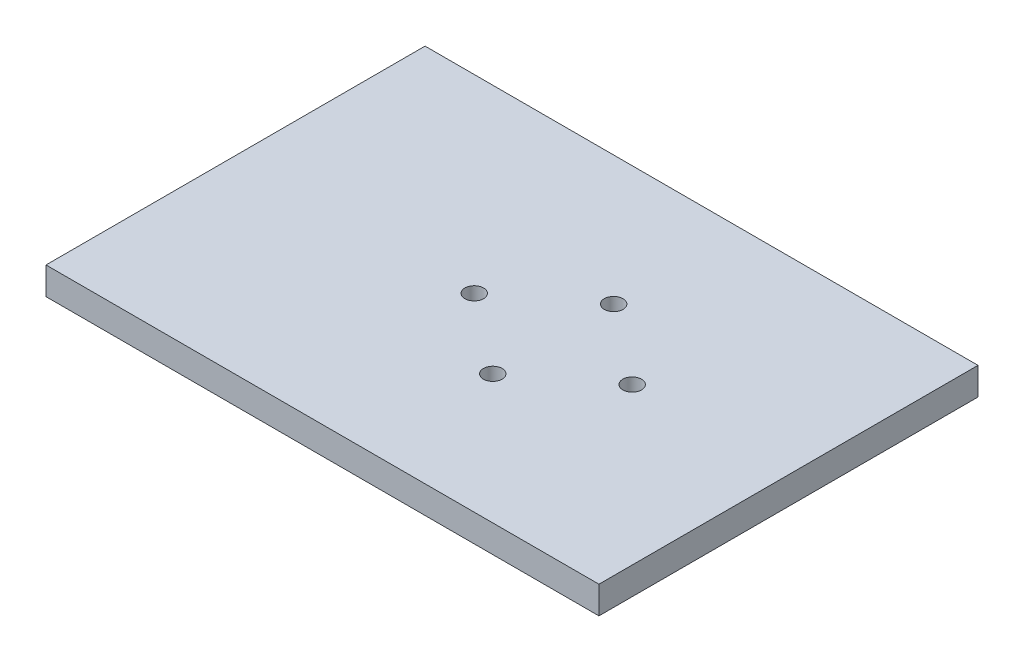
ISO-10303-21;
HEADER;
FILE_DESCRIPTION(('STEP AP214'),'2;1');
FILE_NAME('part.step','',(''),(''),'','','');
FILE_SCHEMA(('AUTOMOTIVE_DESIGN { 1 0 10303 214 1 1 1 1 }'));
ENDSEC;
DATA;
#1=APPLICATION_CONTEXT('core data for automotive mechanical design processes');
#2=APPLICATION_PROTOCOL_DEFINITION('international standard','automotive_design',2000,#1);
#3=PRODUCT_CONTEXT('',#1,'mechanical');
#4=PRODUCT('Part','Part','',(#3));
#5=PRODUCT_RELATED_PRODUCT_CATEGORY('part','',(#4));
#6=PRODUCT_DEFINITION_FORMATION('','',#4);
#7=PRODUCT_DEFINITION_CONTEXT('part definition',#1,'design');
#8=PRODUCT_DEFINITION('design','',#6,#7);
#9=PRODUCT_DEFINITION_SHAPE('','',#8);
#10=(LENGTH_UNIT() NAMED_UNIT(*) SI_UNIT(.MILLI.,.METRE.));
#11=(NAMED_UNIT(*) PLANE_ANGLE_UNIT() SI_UNIT($,.RADIAN.));
#12=(NAMED_UNIT(*) SI_UNIT($,.STERADIAN.) SOLID_ANGLE_UNIT());
#13=UNCERTAINTY_MEASURE_WITH_UNIT(LENGTH_MEASURE(1.E-05),#10,'distance_accuracy_value','');
#14=(GEOMETRIC_REPRESENTATION_CONTEXT(3) GLOBAL_UNCERTAINTY_ASSIGNED_CONTEXT((#13)) GLOBAL_UNIT_ASSIGNED_CONTEXT((#10,
#11,#12)) REPRESENTATION_CONTEXT('',''));
#15=CARTESIAN_POINT('',(0.,0.,0.));
#16=DIRECTION('',(0.,0.,1.));
#17=DIRECTION('',(1.,0.,0.));
#18=AXIS2_PLACEMENT_3D('',#15,#16,#17);
#19=CARTESIAN_POINT('',(0.,5.,0.));
#20=DIRECTION('',(0.,1.,0.));
#21=DIRECTION('',(0.,0.,1.));
#22=AXIS2_PLACEMENT_3D('',#19,#20,#21);
#23=PLANE('',#22);
#24=CARTESIAN_POINT('',(14.375,5.,0.));
#25=DIRECTION('',(0.,1.,0.));
#26=DIRECTION('',(0.,0.,-1.));
#27=AXIS2_PLACEMENT_3D('',#24,#25,#26);
#28=CIRCLE('',#27,1.7);
#29=CARTESIAN_POINT('',(14.375,5.,-1.7));
#30=VERTEX_POINT('',#29);
#31=EDGE_CURVE('E127',#30,#30,#28,.T.);
#32=ORIENTED_EDGE('',*,*,#31,.F.);
#33=EDGE_LOOP('',(#32));
#34=FACE_BOUND('',#33,.T.);
#35=CARTESIAN_POINT('',(0.,5.,11.));
#36=DIRECTION('',(0.,1.,0.));
#37=DIRECTION('',(0.,0.,-1.));
#38=AXIS2_PLACEMENT_3D('',#35,#36,#37);
#39=CIRCLE('',#38,1.7);
#40=CARTESIAN_POINT('',(0.,5.,9.3));
#41=VERTEX_POINT('',#40);
#42=EDGE_CURVE('E106',#41,#41,#39,.T.);
#43=ORIENTED_EDGE('',*,*,#42,.F.);
#44=EDGE_LOOP('',(#43));
#45=FACE_BOUND('',#44,.T.);
#46=DIRECTION('',(0.,0.,1.));
#47=VECTOR('',#46,1.);
#48=CARTESIAN_POINT('',(-57.825,5.,34.5));
#49=LINE('',#48,#47);
#50=CARTESIAN_POINT('',(-57.825,5.,-34.5));
#51=VERTEX_POINT('',#50);
#52=CARTESIAN_POINT('',(-57.825,5.,34.5));
#53=VERTEX_POINT('',#52);
#54=EDGE_CURVE('E91',#51,#53,#49,.T.);
#55=ORIENTED_EDGE('',*,*,#54,.T.);
#56=DIRECTION('',(1.,0.,0.));
#57=VECTOR('',#56,1.);
#58=CARTESIAN_POINT('',(42.825,5.,34.5));
#59=LINE('',#58,#57);
#60=CARTESIAN_POINT('',(42.825,5.,34.5));
#61=VERTEX_POINT('',#60);
#62=EDGE_CURVE('E86',#53,#61,#59,.T.);
#63=ORIENTED_EDGE('',*,*,#62,.T.);
#64=DIRECTION('',(0.,0.,-1.));
#65=VECTOR('',#64,1.);
#66=CARTESIAN_POINT('',(42.825,5.,34.5));
#67=LINE('',#66,#65);
#68=CARTESIAN_POINT('',(42.825,5.,-34.5));
#69=VERTEX_POINT('',#68);
#70=EDGE_CURVE('E89',#61,#69,#67,.T.);
#71=ORIENTED_EDGE('',*,*,#70,.T.);
#72=DIRECTION('',(-1.,0.,0.));
#73=VECTOR('',#72,1.);
#74=CARTESIAN_POINT('',(42.825,5.,-34.5));
#75=LINE('',#74,#73);
#76=EDGE_CURVE('E56',#69,#51,#75,.T.);
#77=ORIENTED_EDGE('',*,*,#76,.T.);
#78=EDGE_LOOP('',(#55,#63,#71,#77));
#79=FACE_BOUND('',#78,.T.);
#80=CARTESIAN_POINT('',(0.,5.,-11.));
#81=DIRECTION('',(0.,1.,0.));
#82=DIRECTION('',(0.,0.,1.));
#83=AXIS2_PLACEMENT_3D('',#80,#81,#82);
#84=CIRCLE('',#83,1.7);
#85=CARTESIAN_POINT('',(0.,5.,-9.3));
#86=VERTEX_POINT('',#85);
#87=EDGE_CURVE('E121',#86,#86,#84,.T.);
#88=ORIENTED_EDGE('',*,*,#87,.F.);
#89=EDGE_LOOP('',(#88));
#90=FACE_BOUND('',#89,.T.);
#91=CARTESIAN_POINT('',(-14.375,5.,0.));
#92=DIRECTION('',(0.,1.,0.));
#93=DIRECTION('',(0.,0.,1.));
#94=AXIS2_PLACEMENT_3D('',#91,#92,#93);
#95=CIRCLE('',#94,1.7);
#96=CARTESIAN_POINT('',(-14.375,5.,1.7));
#97=VERTEX_POINT('',#96);
#98=EDGE_CURVE('E133',#97,#97,#95,.T.);
#99=ORIENTED_EDGE('',*,*,#98,.F.);
#100=EDGE_LOOP('',(#99));
#101=FACE_BOUND('',#100,.T.);
#102=ADVANCED_FACE('F39',(#34,#45,#79,#90,#101),#23,.T.);
#103=CARTESIAN_POINT('',(0.,0.,0.));
#104=DIRECTION('',(0.,1.,0.));
#105=DIRECTION('',(0.,0.,1.));
#106=AXIS2_PLACEMENT_3D('',#103,#104,#105);
#107=PLANE('',#106);
#108=DIRECTION('',(0.,0.,1.));
#109=VECTOR('',#108,1.);
#110=CARTESIAN_POINT('',(-57.825,0.,34.5));
#111=LINE('',#110,#109);
#112=CARTESIAN_POINT('',(-57.825,0.,-34.5));
#113=VERTEX_POINT('',#112);
#114=CARTESIAN_POINT('',(-57.825,0.,34.5));
#115=VERTEX_POINT('',#114);
#116=EDGE_CURVE('E103',#113,#115,#111,.T.);
#117=ORIENTED_EDGE('',*,*,#116,.F.);
#118=DIRECTION('',(-1.,0.,0.));
#119=VECTOR('',#118,1.);
#120=CARTESIAN_POINT('',(42.825,0.,-34.5));
#121=LINE('',#120,#119);
#122=CARTESIAN_POINT('',(42.825,0.,-34.5));
#123=VERTEX_POINT('',#122);
#124=EDGE_CURVE('E79',#123,#113,#121,.T.);
#125=ORIENTED_EDGE('',*,*,#124,.F.);
#126=DIRECTION('',(0.,0.,-1.));
#127=VECTOR('',#126,1.);
#128=CARTESIAN_POINT('',(42.825,0.,34.5));
#129=LINE('',#128,#127);
#130=CARTESIAN_POINT('',(42.825,0.,34.5));
#131=VERTEX_POINT('',#130);
#132=EDGE_CURVE('E73',#131,#123,#129,.T.);
#133=ORIENTED_EDGE('',*,*,#132,.F.);
#134=DIRECTION('',(1.,0.,0.));
#135=VECTOR('',#134,1.);
#136=CARTESIAN_POINT('',(42.825,0.,34.5));
#137=LINE('',#136,#135);
#138=EDGE_CURVE('E95',#115,#131,#137,.T.);
#139=ORIENTED_EDGE('',*,*,#138,.F.);
#140=EDGE_LOOP('',(#117,#125,#133,#139));
#141=FACE_BOUND('',#140,.T.);
#142=CARTESIAN_POINT('',(0.,0.,11.));
#143=DIRECTION('',(0.,1.,0.));
#144=DIRECTION('',(0.,0.,-1.));
#145=AXIS2_PLACEMENT_3D('',#142,#143,#144);
#146=CIRCLE('',#145,1.7);
#147=CARTESIAN_POINT('',(0.,0.,9.3));
#148=VERTEX_POINT('',#147);
#149=EDGE_CURVE('E118',#148,#148,#146,.T.);
#150=ORIENTED_EDGE('',*,*,#149,.T.);
#151=EDGE_LOOP('',(#150));
#152=FACE_BOUND('',#151,.T.);
#153=CARTESIAN_POINT('',(0.,0.,-11.));
#154=DIRECTION('',(0.,1.,0.));
#155=DIRECTION('',(0.,0.,1.));
#156=AXIS2_PLACEMENT_3D('',#153,#154,#155);
#157=CIRCLE('',#156,1.7);
#158=CARTESIAN_POINT('',(0.,0.,-9.3));
#159=VERTEX_POINT('',#158);
#160=EDGE_CURVE('E124',#159,#159,#157,.T.);
#161=ORIENTED_EDGE('',*,*,#160,.T.);
#162=EDGE_LOOP('',(#161));
#163=FACE_BOUND('',#162,.T.);
#164=CARTESIAN_POINT('',(14.375,0.,0.));
#165=DIRECTION('',(0.,1.,0.));
#166=DIRECTION('',(0.,0.,-1.));
#167=AXIS2_PLACEMENT_3D('',#164,#165,#166);
#168=CIRCLE('',#167,1.7);
#169=CARTESIAN_POINT('',(14.375,0.,-1.7));
#170=VERTEX_POINT('',#169);
#171=EDGE_CURVE('E130',#170,#170,#168,.T.);
#172=ORIENTED_EDGE('',*,*,#171,.T.);
#173=EDGE_LOOP('',(#172));
#174=FACE_BOUND('',#173,.T.);
#175=CARTESIAN_POINT('',(-14.375,0.,0.));
#176=DIRECTION('',(0.,1.,0.));
#177=DIRECTION('',(0.,0.,1.));
#178=AXIS2_PLACEMENT_3D('',#175,#176,#177);
#179=CIRCLE('',#178,1.7);
#180=CARTESIAN_POINT('',(-14.375,0.,1.7));
#181=VERTEX_POINT('',#180);
#182=EDGE_CURVE('E136',#181,#181,#179,.T.);
#183=ORIENTED_EDGE('',*,*,#182,.T.);
#184=EDGE_LOOP('',(#183));
#185=FACE_BOUND('',#184,.T.);
#186=ADVANCED_FACE('F114',(#141,#152,#163,#174,#185),#107,.F.);
#187=CARTESIAN_POINT('',(-57.825,5.,34.5));
#188=DIRECTION('',(1.,0.,0.));
#189=DIRECTION('',(0.,0.,-1.));
#190=AXIS2_PLACEMENT_3D('',#187,#188,#189);
#191=PLANE('',#190);
#192=ORIENTED_EDGE('',*,*,#116,.T.);
#193=DIRECTION('',(0.,-1.,0.));
#194=VECTOR('',#193,1.);
#195=CARTESIAN_POINT('',(-57.825,5.,34.5));
#196=LINE('',#195,#194);
#197=EDGE_CURVE('E11',#53,#115,#196,.T.);
#198=ORIENTED_EDGE('',*,*,#197,.F.);
#199=ORIENTED_EDGE('',*,*,#54,.F.);
#200=DIRECTION('',(0.,-1.,0.));
#201=VECTOR('',#200,1.);
#202=CARTESIAN_POINT('',(-57.825,5.,-34.5));
#203=LINE('',#202,#201);
#204=EDGE_CURVE('E99',#51,#113,#203,.T.);
#205=ORIENTED_EDGE('',*,*,#204,.T.);
#206=EDGE_LOOP('',(#192,#198,#199,#205));
#207=FACE_BOUND('',#206,.T.);
#208=ADVANCED_FACE('F41',(#207),#191,.F.);
#209=CARTESIAN_POINT('',(42.825,5.,34.5));
#210=DIRECTION('',(0.,0.,-1.));
#211=DIRECTION('',(-1.,0.,0.));
#212=AXIS2_PLACEMENT_3D('',#209,#210,#211);
#213=PLANE('',#212);
#214=ORIENTED_EDGE('',*,*,#138,.T.);
#215=DIRECTION('',(0.,-1.,0.));
#216=VECTOR('',#215,1.);
#217=CARTESIAN_POINT('',(42.825,5.,34.5));
#218=LINE('',#217,#216);
#219=EDGE_CURVE('E48',#61,#131,#218,.T.);
#220=ORIENTED_EDGE('',*,*,#219,.F.);
#221=ORIENTED_EDGE('',*,*,#62,.F.);
#222=ORIENTED_EDGE('',*,*,#197,.T.);
#223=EDGE_LOOP('',(#214,#220,#221,#222));
#224=FACE_BOUND('',#223,.T.);
#225=ADVANCED_FACE('F94',(#224),#213,.F.);
#226=CARTESIAN_POINT('',(42.825,5.,34.5));
#227=DIRECTION('',(-1.,0.,0.));
#228=DIRECTION('',(0.,0.,1.));
#229=AXIS2_PLACEMENT_3D('',#226,#227,#228);
#230=PLANE('',#229);
#231=ORIENTED_EDGE('',*,*,#132,.T.);
#232=DIRECTION('',(0.,-1.,0.));
#233=VECTOR('',#232,1.);
#234=CARTESIAN_POINT('',(42.825,5.,-34.5));
#235=LINE('',#234,#233);
#236=EDGE_CURVE('E96',#69,#123,#235,.T.);
#237=ORIENTED_EDGE('',*,*,#236,.F.);
#238=ORIENTED_EDGE('',*,*,#70,.F.);
#239=ORIENTED_EDGE('',*,*,#219,.T.);
#240=EDGE_LOOP('',(#231,#237,#238,#239));
#241=FACE_BOUND('',#240,.T.);
#242=ADVANCED_FACE('F97',(#241),#230,.F.);
#243=CARTESIAN_POINT('',(42.825,5.,-34.5));
#244=DIRECTION('',(0.,0.,1.));
#245=DIRECTION('',(1.,0.,0.));
#246=AXIS2_PLACEMENT_3D('',#243,#244,#245);
#247=PLANE('',#246);
#248=ORIENTED_EDGE('',*,*,#124,.T.);
#249=ORIENTED_EDGE('',*,*,#204,.F.);
#250=ORIENTED_EDGE('',*,*,#76,.F.);
#251=ORIENTED_EDGE('',*,*,#236,.T.);
#252=EDGE_LOOP('',(#248,#249,#250,#251));
#253=FACE_BOUND('',#252,.T.);
#254=ADVANCED_FACE('F111',(#253),#247,.F.);
#255=CARTESIAN_POINT('',(0.,5.,11.));
#256=DIRECTION('',(0.,-1.,0.));
#257=DIRECTION('',(0.,0.,-1.));
#258=AXIS2_PLACEMENT_3D('',#255,#256,#257);
#259=CYLINDRICAL_SURFACE('',#258,1.7);
#260=ORIENTED_EDGE('',*,*,#42,.T.);
#261=EDGE_LOOP('',(#260));
#262=FACE_BOUND('',#261,.T.);
#263=ORIENTED_EDGE('',*,*,#149,.F.);
#264=EDGE_LOOP('',(#263));
#265=FACE_BOUND('',#264,.T.);
#266=ADVANCED_FACE('F155',(#262,#265),#259,.F.);
#267=CARTESIAN_POINT('',(0.,5.,-11.));
#268=DIRECTION('',(0.,-1.,0.));
#269=DIRECTION('',(0.,0.,-1.));
#270=AXIS2_PLACEMENT_3D('',#267,#268,#269);
#271=CYLINDRICAL_SURFACE('',#270,1.7);
#272=ORIENTED_EDGE('',*,*,#87,.T.);
#273=EDGE_LOOP('',(#272));
#274=FACE_BOUND('',#273,.T.);
#275=ORIENTED_EDGE('',*,*,#160,.F.);
#276=EDGE_LOOP('',(#275));
#277=FACE_BOUND('',#276,.T.);
#278=ADVANCED_FACE('F200',(#274,#277),#271,.F.);
#279=CARTESIAN_POINT('',(14.375,5.,0.));
#280=DIRECTION('',(0.,-1.,0.));
#281=DIRECTION('',(0.,0.,-1.));
#282=AXIS2_PLACEMENT_3D('',#279,#280,#281);
#283=CYLINDRICAL_SURFACE('',#282,1.7);
#284=ORIENTED_EDGE('',*,*,#31,.T.);
#285=EDGE_LOOP('',(#284));
#286=FACE_BOUND('',#285,.T.);
#287=ORIENTED_EDGE('',*,*,#171,.F.);
#288=EDGE_LOOP('',(#287));
#289=FACE_BOUND('',#288,.T.);
#290=ADVANCED_FACE('F208',(#286,#289),#283,.F.);
#291=CARTESIAN_POINT('',(-14.375,5.,0.));
#292=DIRECTION('',(0.,-1.,0.));
#293=DIRECTION('',(0.,0.,-1.));
#294=AXIS2_PLACEMENT_3D('',#291,#292,#293);
#295=CYLINDRICAL_SURFACE('',#294,1.7);
#296=ORIENTED_EDGE('',*,*,#98,.T.);
#297=EDGE_LOOP('',(#296));
#298=FACE_BOUND('',#297,.T.);
#299=ORIENTED_EDGE('',*,*,#182,.F.);
#300=EDGE_LOOP('',(#299));
#301=FACE_BOUND('',#300,.T.);
#302=ADVANCED_FACE('F142',(#298,#301),#295,.F.);
#303=CLOSED_SHELL('',(#102,#186,#208,#225,#242,#254,#266,#278,#290,#302));
#304=MANIFOLD_SOLID_BREP('B2',#303);
#305=ADVANCED_BREP_SHAPE_REPRESENTATION('',(#18,#304),#14);
#306=SHAPE_DEFINITION_REPRESENTATION(#9,#305);
ENDSEC;
END-ISO-10303-21;
